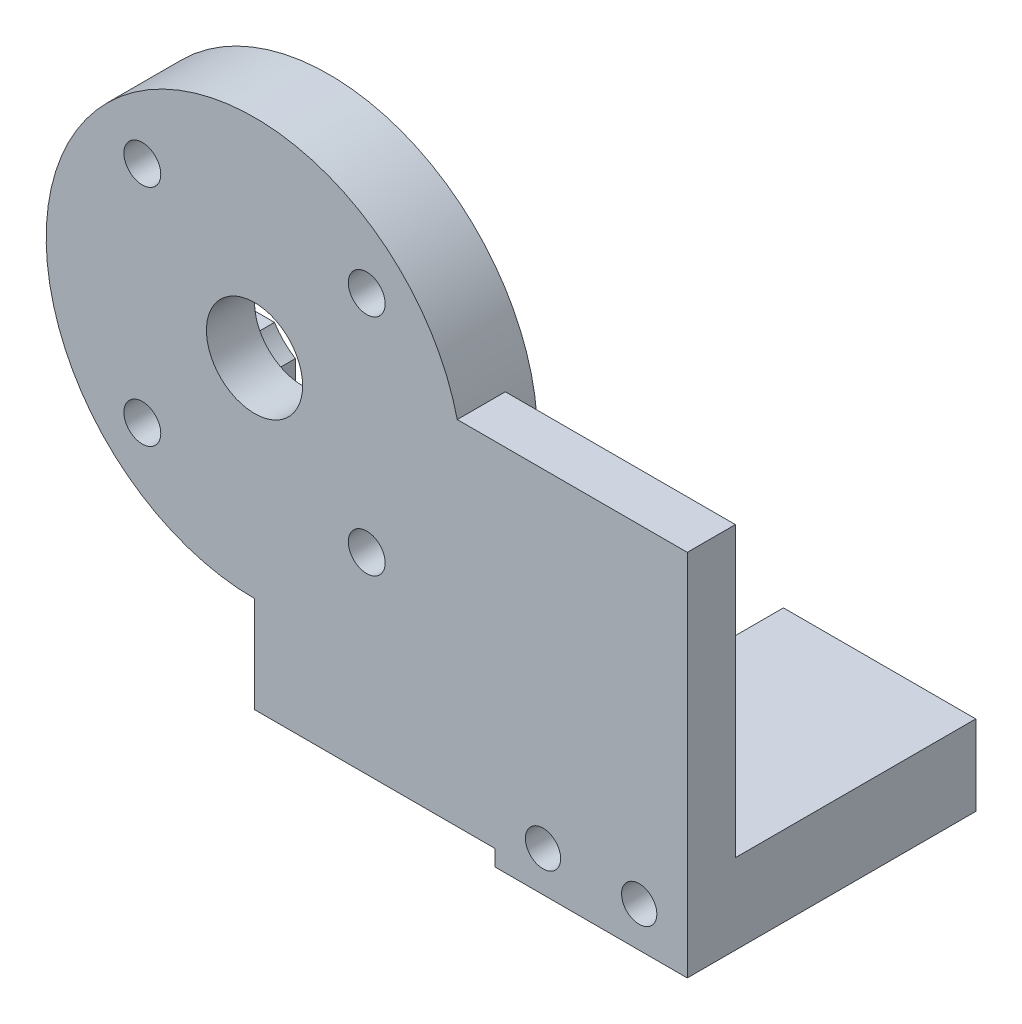
ISO-10303-21;
HEADER;
FILE_DESCRIPTION(('STEP AP214'),'2;1');
FILE_NAME('part.step','',(''),(''),'','','');
FILE_SCHEMA(('AUTOMOTIVE_DESIGN { 1 0 10303 214 1 1 1 1 }'));
ENDSEC;
DATA;
#1=APPLICATION_CONTEXT('core data for automotive mechanical design processes');
#2=APPLICATION_PROTOCOL_DEFINITION('international standard','automotive_design',2000,#1);
#3=PRODUCT_CONTEXT('',#1,'mechanical');
#4=PRODUCT('Part','Part','',(#3));
#5=PRODUCT_RELATED_PRODUCT_CATEGORY('part','',(#4));
#6=PRODUCT_DEFINITION_FORMATION('','',#4);
#7=PRODUCT_DEFINITION_CONTEXT('part definition',#1,'design');
#8=PRODUCT_DEFINITION('design','',#6,#7);
#9=PRODUCT_DEFINITION_SHAPE('','',#8);
#10=(LENGTH_UNIT() NAMED_UNIT(*) SI_UNIT(.MILLI.,.METRE.));
#11=(NAMED_UNIT(*) PLANE_ANGLE_UNIT() SI_UNIT($,.RADIAN.));
#12=(NAMED_UNIT(*) SI_UNIT($,.STERADIAN.) SOLID_ANGLE_UNIT());
#13=UNCERTAINTY_MEASURE_WITH_UNIT(LENGTH_MEASURE(1.E-05),#10,'distance_accuracy_value','');
#14=(GEOMETRIC_REPRESENTATION_CONTEXT(3) GLOBAL_UNCERTAINTY_ASSIGNED_CONTEXT((#13)) GLOBAL_UNIT_ASSIGNED_CONTEXT((#10,
#11,#12)) REPRESENTATION_CONTEXT('',''));
#15=CARTESIAN_POINT('',(0.,0.,0.));
#16=DIRECTION('',(0.,0.,1.));
#17=DIRECTION('',(1.,0.,0.));
#18=AXIS2_PLACEMENT_3D('',#15,#16,#17);
#19=CARTESIAN_POINT('',(0.,0.,13.35));
#20=DIRECTION('',(0.,0.,1.));
#21=DIRECTION('',(1.,0.,0.));
#22=AXIS2_PLACEMENT_3D('',#19,#20,#21);
#23=PLANE('',#22);
#24=CARTESIAN_POINT('',(7.,-7.,13.35));
#25=DIRECTION('',(0.,0.,1.));
#26=DIRECTION('',(1.,0.,0.));
#27=AXIS2_PLACEMENT_3D('',#24,#25,#26);
#28=CIRCLE('',#27,1.15);
#29=CARTESIAN_POINT('',(8.15,-7.,13.35));
#30=VERTEX_POINT('',#29);
#31=EDGE_CURVE('E445',#30,#30,#28,.F.);
#32=ORIENTED_EDGE('',*,*,#31,.F.);
#33=EDGE_LOOP('',(#32));
#34=FACE_BOUND('',#33,.T.);
#35=CARTESIAN_POINT('',(-7.,-7.,13.35));
#36=DIRECTION('',(0.,0.,1.));
#37=DIRECTION('',(1.,0.,0.));
#38=AXIS2_PLACEMENT_3D('',#35,#36,#37);
#39=CIRCLE('',#38,1.15);
#40=CARTESIAN_POINT('',(-5.85,-7.,13.35));
#41=VERTEX_POINT('',#40);
#42=EDGE_CURVE('E437',#41,#41,#39,.F.);
#43=ORIENTED_EDGE('',*,*,#42,.F.);
#44=EDGE_LOOP('',(#43));
#45=FACE_BOUND('',#44,.T.);
#46=CARTESIAN_POINT('',(-7.,7.,13.35));
#47=DIRECTION('',(0.,0.,1.));
#48=DIRECTION('',(1.,0.,0.));
#49=AXIS2_PLACEMENT_3D('',#46,#47,#48);
#50=CIRCLE('',#49,1.15);
#51=CARTESIAN_POINT('',(-5.85,7.,13.35));
#52=VERTEX_POINT('',#51);
#53=EDGE_CURVE('E432',#52,#52,#50,.F.);
#54=ORIENTED_EDGE('',*,*,#53,.F.);
#55=EDGE_LOOP('',(#54));
#56=FACE_BOUND('',#55,.T.);
#57=CARTESIAN_POINT('',(7.,7.,13.35));
#58=DIRECTION('',(0.,0.,1.));
#59=DIRECTION('',(1.,0.,0.));
#60=AXIS2_PLACEMENT_3D('',#57,#58,#59);
#61=CIRCLE('',#60,1.15);
#62=CARTESIAN_POINT('',(8.15,7.,13.35));
#63=VERTEX_POINT('',#62);
#64=EDGE_CURVE('E429',#63,#63,#61,.F.);
#65=ORIENTED_EDGE('',*,*,#64,.F.);
#66=EDGE_LOOP('',(#65));
#67=FACE_BOUND('',#66,.T.);
#68=CARTESIAN_POINT('',(0.,0.,13.35));
#69=DIRECTION('',(0.,0.,1.));
#70=DIRECTION('',(1.,0.,0.));
#71=AXIS2_PLACEMENT_3D('',#68,#69,#70);
#72=CIRCLE('',#71,13.);
#73=CARTESIAN_POINT('',(13.,0.,13.35));
#74=VERTEX_POINT('',#73);
#75=EDGE_CURVE('E271',#74,#74,#72,.T.);
#76=ORIENTED_EDGE('',*,*,#75,.F.);
#77=EDGE_LOOP('',(#76));
#78=FACE_BOUND('',#77,.T.);
#79=DIRECTION('',(-1.,0.,0.));
#80=VECTOR('',#79,1.);
#81=CARTESIAN_POINT('',(-8.15,2.1,13.35));
#82=LINE('',#81,#80);
#83=CARTESIAN_POINT('',(8.15,2.1,13.35));
#84=VERTEX_POINT('',#83);
#85=CARTESIAN_POINT('',(3.40440890610984,2.1,13.35));
#86=VERTEX_POINT('',#85);
#87=EDGE_CURVE('E226',#84,#86,#82,.T.);
#88=ORIENTED_EDGE('',*,*,#87,.T.);
#89=CARTESIAN_POINT('',(0.,0.,13.35));
#90=DIRECTION('',(0.,0.,1.));
#91=DIRECTION('',(1.,0.,0.));
#92=AXIS2_PLACEMENT_3D('',#89,#90,#91);
#93=CIRCLE('',#92,4.);
#94=CARTESIAN_POINT('',(2.1,3.40440890610984,13.35));
#95=VERTEX_POINT('',#94);
#96=EDGE_CURVE('E213',#86,#95,#93,.T.);
#97=ORIENTED_EDGE('',*,*,#96,.T.);
#98=DIRECTION('',(0.,1.,0.));
#99=VECTOR('',#98,1.);
#100=CARTESIAN_POINT('',(2.1,-8.15,13.35));
#101=LINE('',#100,#99);
#102=CARTESIAN_POINT('',(2.1,8.15,13.35));
#103=VERTEX_POINT('',#102);
#104=EDGE_CURVE('E488',#95,#103,#101,.T.);
#105=ORIENTED_EDGE('',*,*,#104,.T.);
#106=CARTESIAN_POINT('',(0.,8.15,13.35));
#107=DIRECTION('',(0.,0.,1.));
#108=DIRECTION('',(1.,0.,0.));
#109=AXIS2_PLACEMENT_3D('',#106,#107,#108);
#110=CIRCLE('',#109,2.1);
#111=CARTESIAN_POINT('',(-2.1,8.15,13.35));
#112=VERTEX_POINT('',#111);
#113=EDGE_CURVE('E458',#103,#112,#110,.T.);
#114=ORIENTED_EDGE('',*,*,#113,.T.);
#115=DIRECTION('',(0.,-1.,0.));
#116=VECTOR('',#115,1.);
#117=CARTESIAN_POINT('',(-2.1,-8.15,13.35));
#118=LINE('',#117,#116);
#119=CARTESIAN_POINT('',(-2.1,3.40440890610984,13.35));
#120=VERTEX_POINT('',#119);
#121=EDGE_CURVE('E482',#112,#120,#118,.T.);
#122=ORIENTED_EDGE('',*,*,#121,.T.);
#123=CARTESIAN_POINT('',(-3.40440890610984,2.1,13.35));
#124=VERTEX_POINT('',#123);
#125=EDGE_CURVE('E72',#120,#124,#93,.T.);
#126=ORIENTED_EDGE('',*,*,#125,.T.);
#127=CARTESIAN_POINT('',(-8.15,2.1,13.35));
#128=VERTEX_POINT('',#127);
#129=EDGE_CURVE('E244',#124,#128,#82,.T.);
#130=ORIENTED_EDGE('',*,*,#129,.T.);
#131=CARTESIAN_POINT('',(-8.15,0.,13.35));
#132=DIRECTION('',(0.,0.,1.));
#133=DIRECTION('',(1.,0.,0.));
#134=AXIS2_PLACEMENT_3D('',#131,#132,#133);
#135=CIRCLE('',#134,2.1);
#136=CARTESIAN_POINT('',(-8.15,-2.1,13.35));
#137=VERTEX_POINT('',#136);
#138=EDGE_CURVE('E454',#128,#137,#135,.T.);
#139=ORIENTED_EDGE('',*,*,#138,.T.);
#140=DIRECTION('',(1.,0.,0.));
#141=VECTOR('',#140,1.);
#142=CARTESIAN_POINT('',(-8.15,-2.1,13.35));
#143=LINE('',#142,#141);
#144=CARTESIAN_POINT('',(-3.40440890610984,-2.1,13.35));
#145=VERTEX_POINT('',#144);
#146=EDGE_CURVE('E249',#137,#145,#143,.T.);
#147=ORIENTED_EDGE('',*,*,#146,.T.);
#148=CARTESIAN_POINT('',(-2.1,-3.40440890610984,13.35));
#149=VERTEX_POINT('',#148);
#150=EDGE_CURVE('E536',#145,#149,#93,.T.);
#151=ORIENTED_EDGE('',*,*,#150,.T.);
#152=CARTESIAN_POINT('',(-2.1,-8.15,13.35));
#153=VERTEX_POINT('',#152);
#154=EDGE_CURVE('E446',#149,#153,#118,.T.);
#155=ORIENTED_EDGE('',*,*,#154,.T.);
#156=CARTESIAN_POINT('',(0.,-8.15,13.35));
#157=DIRECTION('',(0.,0.,1.));
#158=DIRECTION('',(1.,0.,0.));
#159=AXIS2_PLACEMENT_3D('',#156,#157,#158);
#160=CIRCLE('',#159,2.1);
#161=CARTESIAN_POINT('',(2.1,-8.15,13.35));
#162=VERTEX_POINT('',#161);
#163=EDGE_CURVE('E470',#153,#162,#160,.T.);
#164=ORIENTED_EDGE('',*,*,#163,.T.);
#165=CARTESIAN_POINT('',(2.1,-3.40440890610984,13.35));
#166=VERTEX_POINT('',#165);
#167=EDGE_CURVE('E487',#162,#166,#101,.T.);
#168=ORIENTED_EDGE('',*,*,#167,.T.);
#169=CARTESIAN_POINT('',(3.40440890610984,-2.1,13.35));
#170=VERTEX_POINT('',#169);
#171=EDGE_CURVE('E221',#166,#170,#93,.T.);
#172=ORIENTED_EDGE('',*,*,#171,.T.);
#173=CARTESIAN_POINT('',(8.15,-2.1,13.35));
#174=VERTEX_POINT('',#173);
#175=EDGE_CURVE('E501',#170,#174,#143,.T.);
#176=ORIENTED_EDGE('',*,*,#175,.T.);
#177=CARTESIAN_POINT('',(8.15,0.,13.35));
#178=DIRECTION('',(0.,0.,1.));
#179=DIRECTION('',(1.,0.,0.));
#180=AXIS2_PLACEMENT_3D('',#177,#178,#179);
#181=CIRCLE('',#180,2.1);
#182=EDGE_CURVE('E239',#174,#84,#181,.T.);
#183=ORIENTED_EDGE('',*,*,#182,.T.);
#184=EDGE_LOOP('',(#88,#97,#105,#114,#122,#126,#130,#139,#147,#151,#155,#164,#168,#172,#176,#183));
#185=FACE_BOUND('',#184,.T.);
#186=ADVANCED_FACE('F44',(#34,#45,#56,#67,#78,#185),#23,.F.);
#187=CARTESIAN_POINT('',(-8.15,-2.1,15.));
#188=DIRECTION('',(0.,1.,0.));
#189=DIRECTION('',(0.,0.,1.));
#190=AXIS2_PLACEMENT_3D('',#187,#188,#189);
#191=PLANE('',#190);
#192=ORIENTED_EDGE('',*,*,#175,.F.);
#193=DIRECTION('',(0.,0.,-1.));
#194=VECTOR('',#193,1.);
#195=CARTESIAN_POINT('',(3.40440890610984,-2.1,15.));
#196=LINE('',#195,#194);
#197=CARTESIAN_POINT('',(3.40440890610984,-2.1,15.));
#198=VERTEX_POINT('',#197);
#199=EDGE_CURVE('E231',#170,#198,#196,.F.);
#200=ORIENTED_EDGE('',*,*,#199,.T.);
#201=DIRECTION('',(1.,0.,0.));
#202=VECTOR('',#201,1.);
#203=CARTESIAN_POINT('',(-8.15,-2.1,15.));
#204=LINE('',#203,#202);
#205=CARTESIAN_POINT('',(8.15,-2.1,15.));
#206=VERTEX_POINT('',#205);
#207=EDGE_CURVE('E243',#198,#206,#204,.T.);
#208=ORIENTED_EDGE('',*,*,#207,.T.);
#209=DIRECTION('',(0.,0.,-1.));
#210=VECTOR('',#209,1.);
#211=CARTESIAN_POINT('',(8.15,-2.1,15.));
#212=LINE('',#211,#210);
#213=EDGE_CURVE('E259',#206,#174,#212,.T.);
#214=ORIENTED_EDGE('',*,*,#213,.T.);
#215=EDGE_LOOP('',(#192,#200,#208,#214));
#216=FACE_BOUND('',#215,.T.);
#217=ADVANCED_FACE('F544',(#216),#191,.T.);
#218=CARTESIAN_POINT('',(-8.15,2.1,15.));
#219=DIRECTION('',(0.,-1.,0.));
#220=DIRECTION('',(0.,0.,-1.));
#221=AXIS2_PLACEMENT_3D('',#218,#219,#220);
#222=PLANE('',#221);
#223=DIRECTION('',(-1.,0.,0.));
#224=VECTOR('',#223,1.);
#225=CARTESIAN_POINT('',(-8.15,2.1,15.));
#226=LINE('',#225,#224);
#227=CARTESIAN_POINT('',(8.15,2.1,15.));
#228=VERTEX_POINT('',#227);
#229=CARTESIAN_POINT('',(3.40440890610984,2.1,15.));
#230=VERTEX_POINT('',#229);
#231=EDGE_CURVE('E235',#228,#230,#226,.T.);
#232=ORIENTED_EDGE('',*,*,#231,.T.);
#233=DIRECTION('',(0.,0.,-1.));
#234=VECTOR('',#233,1.);
#235=CARTESIAN_POINT('',(3.40440890610984,2.1,15.));
#236=LINE('',#235,#234);
#237=EDGE_CURVE('E216',#230,#86,#236,.T.);
#238=ORIENTED_EDGE('',*,*,#237,.T.);
#239=ORIENTED_EDGE('',*,*,#87,.F.);
#240=DIRECTION('',(0.,0.,-1.));
#241=VECTOR('',#240,1.);
#242=CARTESIAN_POINT('',(8.15,2.1,15.));
#243=LINE('',#242,#241);
#244=EDGE_CURVE('E258',#228,#84,#243,.T.);
#245=ORIENTED_EDGE('',*,*,#244,.F.);
#246=EDGE_LOOP('',(#232,#238,#239,#245));
#247=FACE_BOUND('',#246,.T.);
#248=ADVANCED_FACE('F227',(#247),#222,.T.);
#249=ORIENTED_EDGE('',*,*,#129,.F.);
#250=DIRECTION('',(0.,0.,-1.));
#251=VECTOR('',#250,1.);
#252=CARTESIAN_POINT('',(-3.40440890610984,2.1,15.));
#253=LINE('',#252,#251);
#254=CARTESIAN_POINT('',(-3.40440890610984,2.1,15.));
#255=VERTEX_POINT('',#254);
#256=EDGE_CURVE('E233',#124,#255,#253,.F.);
#257=ORIENTED_EDGE('',*,*,#256,.T.);
#258=CARTESIAN_POINT('',(-8.15,2.1,15.));
#259=VERTEX_POINT('',#258);
#260=EDGE_CURVE('E509',#255,#259,#226,.T.);
#261=ORIENTED_EDGE('',*,*,#260,.T.);
#262=DIRECTION('',(0.,0.,-1.));
#263=VECTOR('',#262,1.);
#264=CARTESIAN_POINT('',(-8.15,2.1,15.));
#265=LINE('',#264,#263);
#266=EDGE_CURVE('E252',#259,#128,#265,.T.);
#267=ORIENTED_EDGE('',*,*,#266,.T.);
#268=EDGE_LOOP('',(#249,#257,#261,#267));
#269=FACE_BOUND('',#268,.T.);
#270=ADVANCED_FACE('F513',(#269),#222,.T.);
#271=CARTESIAN_POINT('',(-8.15,-2.1,15.));
#272=VERTEX_POINT('',#271);
#273=CARTESIAN_POINT('',(-3.40440890610984,-2.1,15.));
#274=VERTEX_POINT('',#273);
#275=EDGE_CURVE('E247',#272,#274,#204,.T.);
#276=ORIENTED_EDGE('',*,*,#275,.T.);
#277=DIRECTION('',(0.,0.,-1.));
#278=VECTOR('',#277,1.);
#279=CARTESIAN_POINT('',(-3.40440890610984,-2.1,15.));
#280=LINE('',#279,#278);
#281=EDGE_CURVE('E404',#274,#145,#280,.T.);
#282=ORIENTED_EDGE('',*,*,#281,.T.);
#283=ORIENTED_EDGE('',*,*,#146,.F.);
#284=DIRECTION('',(0.,0.,-1.));
#285=VECTOR('',#284,1.);
#286=CARTESIAN_POINT('',(-8.15,-2.1,15.));
#287=LINE('',#286,#285);
#288=EDGE_CURVE('E263',#272,#137,#287,.T.);
#289=ORIENTED_EDGE('',*,*,#288,.F.);
#290=EDGE_LOOP('',(#276,#282,#283,#289));
#291=FACE_BOUND('',#290,.T.);
#292=ADVANCED_FACE('F533',(#291),#191,.T.);
#293=CARTESIAN_POINT('',(2.1,-8.15,15.));
#294=DIRECTION('',(-1.,0.,0.));
#295=DIRECTION('',(0.,0.,1.));
#296=AXIS2_PLACEMENT_3D('',#293,#294,#295);
#297=PLANE('',#296);
#298=ORIENTED_EDGE('',*,*,#104,.F.);
#299=DIRECTION('',(0.,0.,-1.));
#300=VECTOR('',#299,1.);
#301=CARTESIAN_POINT('',(2.1,3.40440890610984,15.));
#302=LINE('',#301,#300);
#303=CARTESIAN_POINT('',(2.1,3.40440890610984,15.));
#304=VERTEX_POINT('',#303);
#305=EDGE_CURVE('E220',#95,#304,#302,.F.);
#306=ORIENTED_EDGE('',*,*,#305,.T.);
#307=DIRECTION('',(0.,1.,0.));
#308=VECTOR('',#307,1.);
#309=CARTESIAN_POINT('',(2.1,-8.15,15.));
#310=LINE('',#309,#308);
#311=CARTESIAN_POINT('',(2.1,8.15,15.));
#312=VERTEX_POINT('',#311);
#313=EDGE_CURVE('E480',#304,#312,#310,.T.);
#314=ORIENTED_EDGE('',*,*,#313,.T.);
#315=DIRECTION('',(0.,0.,-1.));
#316=VECTOR('',#315,1.);
#317=CARTESIAN_POINT('',(2.1,8.15,15.));
#318=LINE('',#317,#316);
#319=EDGE_CURVE('E494',#312,#103,#318,.T.);
#320=ORIENTED_EDGE('',*,*,#319,.T.);
#321=EDGE_LOOP('',(#298,#306,#314,#320));
#322=FACE_BOUND('',#321,.T.);
#323=ADVANCED_FACE('F644',(#322),#297,.T.);
#324=CARTESIAN_POINT('',(-2.1,-8.15,15.));
#325=DIRECTION('',(1.,0.,0.));
#326=DIRECTION('',(0.,0.,-1.));
#327=AXIS2_PLACEMENT_3D('',#324,#325,#326);
#328=PLANE('',#327);
#329=DIRECTION('',(0.,-1.,0.));
#330=VECTOR('',#329,1.);
#331=CARTESIAN_POINT('',(-2.1,-8.15,15.));
#332=LINE('',#331,#330);
#333=CARTESIAN_POINT('',(-2.1,8.15,15.));
#334=VERTEX_POINT('',#333);
#335=CARTESIAN_POINT('',(-2.1,3.40440890610984,15.));
#336=VERTEX_POINT('',#335);
#337=EDGE_CURVE('E471',#334,#336,#332,.T.);
#338=ORIENTED_EDGE('',*,*,#337,.T.);
#339=DIRECTION('',(0.,0.,-1.));
#340=VECTOR('',#339,1.);
#341=CARTESIAN_POINT('',(-2.1,3.40440890610984,15.));
#342=LINE('',#341,#340);
#343=EDGE_CURVE('E396',#336,#120,#342,.T.);
#344=ORIENTED_EDGE('',*,*,#343,.T.);
#345=ORIENTED_EDGE('',*,*,#121,.F.);
#346=DIRECTION('',(0.,0.,-1.));
#347=VECTOR('',#346,1.);
#348=CARTESIAN_POINT('',(-2.1,8.15,15.));
#349=LINE('',#348,#347);
#350=EDGE_CURVE('E483',#334,#112,#349,.T.);
#351=ORIENTED_EDGE('',*,*,#350,.F.);
#352=EDGE_LOOP('',(#338,#344,#345,#351));
#353=FACE_BOUND('',#352,.T.);
#354=ADVANCED_FACE('F775',(#353),#328,.T.);
#355=ORIENTED_EDGE('',*,*,#154,.F.);
#356=DIRECTION('',(0.,0.,-1.));
#357=VECTOR('',#356,1.);
#358=CARTESIAN_POINT('',(-2.1,-3.40440890610984,15.));
#359=LINE('',#358,#357);
#360=CARTESIAN_POINT('',(-2.1,-3.40440890610984,15.));
#361=VERTEX_POINT('',#360);
#362=EDGE_CURVE('E392',#149,#361,#359,.F.);
#363=ORIENTED_EDGE('',*,*,#362,.T.);
#364=CARTESIAN_POINT('',(-2.1,-8.15,15.));
#365=VERTEX_POINT('',#364);
#366=EDGE_CURVE('E476',#361,#365,#332,.T.);
#367=ORIENTED_EDGE('',*,*,#366,.T.);
#368=DIRECTION('',(0.,0.,-1.));
#369=VECTOR('',#368,1.);
#370=CARTESIAN_POINT('',(-2.1,-8.15,15.));
#371=LINE('',#370,#369);
#372=EDGE_CURVE('E504',#365,#153,#371,.T.);
#373=ORIENTED_EDGE('',*,*,#372,.T.);
#374=EDGE_LOOP('',(#355,#363,#367,#373));
#375=FACE_BOUND('',#374,.T.);
#376=ADVANCED_FACE('F568',(#375),#328,.T.);
#377=CARTESIAN_POINT('',(2.1,-8.15,15.));
#378=VERTEX_POINT('',#377);
#379=CARTESIAN_POINT('',(2.1,-3.40440890610984,15.));
#380=VERTEX_POINT('',#379);
#381=EDGE_CURVE('E479',#378,#380,#310,.T.);
#382=ORIENTED_EDGE('',*,*,#381,.T.);
#383=DIRECTION('',(0.,0.,-1.));
#384=VECTOR('',#383,1.);
#385=CARTESIAN_POINT('',(2.1,-3.40440890610984,15.));
#386=LINE('',#385,#384);
#387=EDGE_CURVE('E11',#380,#166,#386,.T.);
#388=ORIENTED_EDGE('',*,*,#387,.T.);
#389=ORIENTED_EDGE('',*,*,#167,.F.);
#390=DIRECTION('',(0.,0.,-1.));
#391=VECTOR('',#390,1.);
#392=CARTESIAN_POINT('',(2.1,-8.15,15.));
#393=LINE('',#392,#391);
#394=EDGE_CURVE('E496',#378,#162,#393,.T.);
#395=ORIENTED_EDGE('',*,*,#394,.F.);
#396=EDGE_LOOP('',(#382,#388,#389,#395));
#397=FACE_BOUND('',#396,.T.);
#398=ADVANCED_FACE('F561',(#397),#297,.T.);
#399=CARTESIAN_POINT('',(0.,0.,15.));
#400=DIRECTION('',(0.,0.,1.));
#401=DIRECTION('',(1.,0.,0.));
#402=AXIS2_PLACEMENT_3D('',#399,#400,#401);
#403=PLANE('',#402);
#404=DIRECTION('',(0.,-1.,0.));
#405=VECTOR('',#404,1.);
#406=CARTESIAN_POINT('',(0.,-19.,15.));
#407=LINE('',#406,#405);
#408=CARTESIAN_POINT('',(0.,-13.,15.));
#409=VERTEX_POINT('',#408);
#410=CARTESIAN_POINT('',(0.,-19.,15.));
#411=VERTEX_POINT('',#410);
#412=EDGE_CURVE('E321',#409,#411,#407,.T.);
#413=ORIENTED_EDGE('',*,*,#412,.F.);
#414=CARTESIAN_POINT('',(0.,0.,15.));
#415=DIRECTION('',(0.,0.,1.));
#416=DIRECTION('',(1.,0.,0.));
#417=AXIS2_PLACEMENT_3D('',#414,#415,#416);
#418=CIRCLE('',#417,13.);
#419=CARTESIAN_POINT('',(12.6491106406735,3.,15.));
#420=VERTEX_POINT('',#419);
#421=EDGE_CURVE('E270',#409,#420,#418,.T.);
#422=ORIENTED_EDGE('',*,*,#421,.T.);
#423=DIRECTION('',(-1.,0.,0.));
#424=VECTOR('',#423,1.);
#425=CARTESIAN_POINT('',(0.,3.,15.));
#426=LINE('',#425,#424);
#427=CARTESIAN_POINT('',(27.,3.,15.));
#428=VERTEX_POINT('',#427);
#429=EDGE_CURVE('E326',#428,#420,#426,.T.);
#430=ORIENTED_EDGE('',*,*,#429,.F.);
#431=DIRECTION('',(0.,1.,0.));
#432=VECTOR('',#431,1.);
#433=CARTESIAN_POINT('',(27.,-19.,15.));
#434=LINE('',#433,#432);
#435=CARTESIAN_POINT('',(27.,-15.,15.));
#436=VERTEX_POINT('',#435);
#437=EDGE_CURVE('E344',#436,#428,#434,.T.);
#438=ORIENTED_EDGE('',*,*,#437,.F.);
#439=DIRECTION('',(1.,0.,0.));
#440=VECTOR('',#439,1.);
#441=CARTESIAN_POINT('',(0.,-15.,15.));
#442=LINE('',#441,#440);
#443=CARTESIAN_POINT('',(15.,-15.,15.));
#444=VERTEX_POINT('',#443);
#445=EDGE_CURVE('E54',#444,#436,#442,.T.);
#446=ORIENTED_EDGE('',*,*,#445,.F.);
#447=DIRECTION('',(0.,1.,0.));
#448=VECTOR('',#447,1.);
#449=CARTESIAN_POINT('',(15.,0.,15.));
#450=LINE('',#449,#448);
#451=CARTESIAN_POINT('',(15.,-19.,15.));
#452=VERTEX_POINT('',#451);
#453=EDGE_CURVE('E320',#452,#444,#450,.T.);
#454=ORIENTED_EDGE('',*,*,#453,.F.);
#455=DIRECTION('',(1.,0.,0.));
#456=VECTOR('',#455,1.);
#457=CARTESIAN_POINT('',(0.,-19.,15.));
#458=LINE('',#457,#456);
#459=EDGE_CURVE('E336',#411,#452,#458,.T.);
#460=ORIENTED_EDGE('',*,*,#459,.F.);
#461=EDGE_LOOP('',(#413,#422,#430,#438,#446,#454,#460));
#462=FACE_BOUND('',#461,.T.);
#463=ADVANCED_FACE('F630',(#462),#403,.F.);
#464=CARTESIAN_POINT('',(0.,-19.,18.));
#465=DIRECTION('',(0.,1.,0.));
#466=DIRECTION('',(0.,0.,1.));
#467=AXIS2_PLACEMENT_3D('',#464,#465,#466);
#468=PLANE('',#467);
#469=DIRECTION('',(0.,0.,-1.));
#470=VECTOR('',#469,1.);
#471=CARTESIAN_POINT('',(15.,-19.,18.));
#472=LINE('',#471,#470);
#473=CARTESIAN_POINT('',(15.,-19.,18.));
#474=VERTEX_POINT('',#473);
#475=EDGE_CURVE('E366',#474,#452,#472,.T.);
#476=ORIENTED_EDGE('',*,*,#475,.F.);
#477=DIRECTION('',(1.,0.,0.));
#478=VECTOR('',#477,1.);
#479=CARTESIAN_POINT('',(0.,-19.,18.));
#480=LINE('',#479,#478);
#481=CARTESIAN_POINT('',(0.,-19.,18.));
#482=VERTEX_POINT('',#481);
#483=EDGE_CURVE('E324',#482,#474,#480,.T.);
#484=ORIENTED_EDGE('',*,*,#483,.F.);
#485=DIRECTION('',(0.,0.,-1.));
#486=VECTOR('',#485,1.);
#487=CARTESIAN_POINT('',(0.,-19.,18.));
#488=LINE('',#487,#486);
#489=EDGE_CURVE('E354',#482,#411,#488,.T.);
#490=ORIENTED_EDGE('',*,*,#489,.T.);
#491=ORIENTED_EDGE('',*,*,#459,.T.);
#492=EDGE_LOOP('',(#476,#484,#490,#491));
#493=FACE_BOUND('',#492,.T.);
#494=ADVANCED_FACE('F628',(#493),#468,.F.);
#495=CARTESIAN_POINT('',(0.,0.,18.));
#496=DIRECTION('',(0.,0.,-1.));
#497=DIRECTION('',(-1.,0.,0.));
#498=AXIS2_PLACEMENT_3D('',#495,#496,#497);
#499=CYLINDRICAL_SURFACE('',#498,13.);
#500=DIRECTION('',(0.,0.,-1.));
#501=VECTOR('',#500,1.);
#502=CARTESIAN_POINT('',(0.,-13.,18.));
#503=LINE('',#502,#501);
#504=CARTESIAN_POINT('',(0.,-13.,18.));
#505=VERTEX_POINT('',#504);
#506=EDGE_CURVE('E365',#505,#409,#503,.T.);
#507=ORIENTED_EDGE('',*,*,#506,.F.);
#508=CARTESIAN_POINT('',(0.,0.,18.));
#509=DIRECTION('',(0.,0.,1.));
#510=DIRECTION('',(1.,0.,0.));
#511=AXIS2_PLACEMENT_3D('',#508,#509,#510);
#512=CIRCLE('',#511,13.);
#513=CARTESIAN_POINT('',(12.6491106406735,3.,18.));
#514=VERTEX_POINT('',#513);
#515=EDGE_CURVE('E358',#514,#505,#512,.T.);
#516=ORIENTED_EDGE('',*,*,#515,.F.);
#517=DIRECTION('',(0.,0.,-1.));
#518=VECTOR('',#517,1.);
#519=CARTESIAN_POINT('',(12.6491106406735,3.,18.));
#520=LINE('',#519,#518);
#521=EDGE_CURVE('E357',#420,#514,#520,.F.);
#522=ORIENTED_EDGE('',*,*,#521,.F.);
#523=ORIENTED_EDGE('',*,*,#421,.F.);
#524=EDGE_LOOP('',(#507,#516,#522,#523));
#525=FACE_BOUND('',#524,.T.);
#526=ORIENTED_EDGE('',*,*,#75,.T.);
#527=EDGE_LOOP('',(#526));
#528=FACE_BOUND('',#527,.T.);
#529=ADVANCED_FACE('F50',(#525,#528),#499,.T.);
#530=CARTESIAN_POINT('',(0.,0.,18.));
#531=DIRECTION('',(0.,0.,1.));
#532=DIRECTION('',(1.,0.,0.));
#533=AXIS2_PLACEMENT_3D('',#530,#531,#532);
#534=PLANE('',#533);
#535=CARTESIAN_POINT('',(18.,-17.5,18.));
#536=DIRECTION('',(0.,0.,1.));
#537=DIRECTION('',(1.,0.,0.));
#538=AXIS2_PLACEMENT_3D('',#535,#536,#537);
#539=CIRCLE('',#538,1.1);
#540=CARTESIAN_POINT('',(19.1,-17.5,18.));
#541=VERTEX_POINT('',#540);
#542=EDGE_CURVE('E380',#541,#541,#539,.T.);
#543=ORIENTED_EDGE('',*,*,#542,.F.);
#544=EDGE_LOOP('',(#543));
#545=FACE_BOUND('',#544,.T.);
#546=CARTESIAN_POINT('',(24.,-17.5,18.));
#547=DIRECTION('',(0.,0.,1.));
#548=DIRECTION('',(1.,0.,0.));
#549=AXIS2_PLACEMENT_3D('',#546,#547,#548);
#550=CIRCLE('',#549,1.1);
#551=CARTESIAN_POINT('',(25.1,-17.5,18.));
#552=VERTEX_POINT('',#551);
#553=EDGE_CURVE('E383',#552,#552,#550,.T.);
#554=ORIENTED_EDGE('',*,*,#553,.F.);
#555=EDGE_LOOP('',(#554));
#556=FACE_BOUND('',#555,.T.);
#557=CARTESIAN_POINT('',(7.,-7.,18.));
#558=DIRECTION('',(0.,0.,1.));
#559=DIRECTION('',(1.,0.,0.));
#560=AXIS2_PLACEMENT_3D('',#557,#558,#559);
#561=CIRCLE('',#560,1.15);
#562=CARTESIAN_POINT('',(8.15,-7.,18.));
#563=VERTEX_POINT('',#562);
#564=EDGE_CURVE('E411',#563,#563,#561,.T.);
#565=ORIENTED_EDGE('',*,*,#564,.F.);
#566=EDGE_LOOP('',(#565));
#567=FACE_BOUND('',#566,.T.);
#568=CARTESIAN_POINT('',(-7.,-7.,18.));
#569=DIRECTION('',(0.,0.,1.));
#570=DIRECTION('',(1.,0.,0.));
#571=AXIS2_PLACEMENT_3D('',#568,#569,#570);
#572=CIRCLE('',#571,1.15);
#573=CARTESIAN_POINT('',(-5.85,-7.,18.));
#574=VERTEX_POINT('',#573);
#575=EDGE_CURVE('E419',#574,#574,#572,.T.);
#576=ORIENTED_EDGE('',*,*,#575,.F.);
#577=EDGE_LOOP('',(#576));
#578=FACE_BOUND('',#577,.T.);
#579=CARTESIAN_POINT('',(-7.,7.,18.));
#580=DIRECTION('',(0.,0.,1.));
#581=DIRECTION('',(1.,0.,0.));
#582=AXIS2_PLACEMENT_3D('',#579,#580,#581);
#583=CIRCLE('',#582,1.15);
#584=CARTESIAN_POINT('',(-5.85,7.,18.));
#585=VERTEX_POINT('',#584);
#586=EDGE_CURVE('E413',#585,#585,#583,.T.);
#587=ORIENTED_EDGE('',*,*,#586,.F.);
#588=EDGE_LOOP('',(#587));
#589=FACE_BOUND('',#588,.T.);
#590=CARTESIAN_POINT('',(7.,7.,18.));
#591=DIRECTION('',(0.,0.,1.));
#592=DIRECTION('',(1.,0.,0.));
#593=AXIS2_PLACEMENT_3D('',#590,#591,#592);
#594=CIRCLE('',#593,1.15);
#595=CARTESIAN_POINT('',(8.15,7.,18.));
#596=VERTEX_POINT('',#595);
#597=EDGE_CURVE('E420',#596,#596,#594,.T.);
#598=ORIENTED_EDGE('',*,*,#597,.F.);
#599=EDGE_LOOP('',(#598));
#600=FACE_BOUND('',#599,.T.);
#601=CARTESIAN_POINT('',(0.,0.,18.));
#602=DIRECTION('',(0.,0.,1.));
#603=DIRECTION('',(1.,0.,0.));
#604=AXIS2_PLACEMENT_3D('',#601,#602,#603);
#605=CIRCLE('',#604,3.);
#606=CARTESIAN_POINT('',(3.,0.,18.));
#607=VERTEX_POINT('',#606);
#608=EDGE_CURVE('E269',#607,#607,#605,.T.);
#609=ORIENTED_EDGE('',*,*,#608,.F.);
#610=EDGE_LOOP('',(#609));
#611=FACE_BOUND('',#610,.T.);
#612=ORIENTED_EDGE('',*,*,#483,.T.);
#613=DIRECTION('',(0.,-1.,0.));
#614=VECTOR('',#613,1.);
#615=CARTESIAN_POINT('',(15.,-20.,18.));
#616=LINE('',#615,#614);
#617=CARTESIAN_POINT('',(15.,-20.,18.));
#618=VERTEX_POINT('',#617);
#619=EDGE_CURVE('E284',#474,#618,#616,.T.);
#620=ORIENTED_EDGE('',*,*,#619,.T.);
#621=DIRECTION('',(1.,0.,0.));
#622=VECTOR('',#621,1.);
#623=CARTESIAN_POINT('',(15.,-20.,18.));
#624=LINE('',#623,#622);
#625=CARTESIAN_POINT('',(27.,-20.,18.));
#626=VERTEX_POINT('',#625);
#627=EDGE_CURVE('E281',#618,#626,#624,.T.);
#628=ORIENTED_EDGE('',*,*,#627,.T.);
#629=DIRECTION('',(0.,1.,0.));
#630=VECTOR('',#629,1.);
#631=CARTESIAN_POINT('',(27.,-19.,18.));
#632=LINE('',#631,#630);
#633=CARTESIAN_POINT('',(27.,3.,18.));
#634=VERTEX_POINT('',#633);
#635=EDGE_CURVE('E329',#626,#634,#632,.T.);
#636=ORIENTED_EDGE('',*,*,#635,.T.);
#637=DIRECTION('',(-1.,0.,0.));
#638=VECTOR('',#637,1.);
#639=CARTESIAN_POINT('',(0.,3.,18.));
#640=LINE('',#639,#638);
#641=EDGE_CURVE('E334',#634,#514,#640,.T.);
#642=ORIENTED_EDGE('',*,*,#641,.T.);
#643=ORIENTED_EDGE('',*,*,#515,.T.);
#644=DIRECTION('',(0.,-1.,0.));
#645=VECTOR('',#644,1.);
#646=CARTESIAN_POINT('',(0.,-19.,18.));
#647=LINE('',#646,#645);
#648=EDGE_CURVE('E325',#505,#482,#647,.T.);
#649=ORIENTED_EDGE('',*,*,#648,.T.);
#650=EDGE_LOOP('',(#612,#620,#628,#636,#642,#643,#649));
#651=FACE_BOUND('',#650,.T.);
#652=ADVANCED_FACE('F634',(#545,#556,#567,#578,#589,#600,#611,#651),#534,.T.);
#653=CARTESIAN_POINT('',(0.,-19.,18.));
#654=DIRECTION('',(1.,0.,0.));
#655=DIRECTION('',(0.,0.,-1.));
#656=AXIS2_PLACEMENT_3D('',#653,#654,#655);
#657=PLANE('',#656);
#658=ORIENTED_EDGE('',*,*,#648,.F.);
#659=ORIENTED_EDGE('',*,*,#506,.T.);
#660=ORIENTED_EDGE('',*,*,#412,.T.);
#661=ORIENTED_EDGE('',*,*,#489,.F.);
#662=EDGE_LOOP('',(#658,#659,#660,#661));
#663=FACE_BOUND('',#662,.T.);
#664=ADVANCED_FACE('F622',(#663),#657,.F.);
#665=CARTESIAN_POINT('',(0.,3.,18.));
#666=DIRECTION('',(0.,-1.,0.));
#667=DIRECTION('',(0.,0.,-1.));
#668=AXIS2_PLACEMENT_3D('',#665,#666,#667);
#669=PLANE('',#668);
#670=ORIENTED_EDGE('',*,*,#429,.T.);
#671=ORIENTED_EDGE('',*,*,#521,.T.);
#672=ORIENTED_EDGE('',*,*,#641,.F.);
#673=DIRECTION('',(0.,0.,-1.));
#674=VECTOR('',#673,1.);
#675=CARTESIAN_POINT('',(27.,3.,18.));
#676=LINE('',#675,#674);
#677=EDGE_CURVE('E339',#634,#428,#676,.T.);
#678=ORIENTED_EDGE('',*,*,#677,.T.);
#679=EDGE_LOOP('',(#670,#671,#672,#678));
#680=FACE_BOUND('',#679,.T.);
#681=ADVANCED_FACE('F619',(#680),#669,.F.);
#682=CARTESIAN_POINT('',(27.,-19.,18.));
#683=DIRECTION('',(-1.,0.,0.));
#684=DIRECTION('',(0.,0.,1.));
#685=AXIS2_PLACEMENT_3D('',#682,#683,#684);
#686=PLANE('',#685);
#687=DIRECTION('',(0.,0.,-1.));
#688=VECTOR('',#687,1.);
#689=CARTESIAN_POINT('',(27.,-15.,18.));
#690=LINE('',#689,#688);
#691=CARTESIAN_POINT('',(27.,-15.,0.));
#692=VERTEX_POINT('',#691);
#693=EDGE_CURVE('E308',#436,#692,#690,.T.);
#694=ORIENTED_EDGE('',*,*,#693,.F.);
#695=ORIENTED_EDGE('',*,*,#437,.T.);
#696=ORIENTED_EDGE('',*,*,#677,.F.);
#697=ORIENTED_EDGE('',*,*,#635,.F.);
#698=DIRECTION('',(0.,0.,-1.));
#699=VECTOR('',#698,1.);
#700=CARTESIAN_POINT('',(27.,-20.,18.));
#701=LINE('',#700,#699);
#702=CARTESIAN_POINT('',(27.,-20.,0.));
#703=VERTEX_POINT('',#702);
#704=EDGE_CURVE('E310',#626,#703,#701,.T.);
#705=ORIENTED_EDGE('',*,*,#704,.T.);
#706=DIRECTION('',(0.,1.,0.));
#707=VECTOR('',#706,1.);
#708=CARTESIAN_POINT('',(27.,-20.,0.));
#709=LINE('',#708,#707);
#710=EDGE_CURVE('E299',#703,#692,#709,.T.);
#711=ORIENTED_EDGE('',*,*,#710,.T.);
#712=EDGE_LOOP('',(#694,#695,#696,#697,#705,#711));
#713=FACE_BOUND('',#712,.T.);
#714=ADVANCED_FACE('F608',(#713),#686,.F.);
#715=CARTESIAN_POINT('',(15.,-15.,18.));
#716=DIRECTION('',(0.,-1.,0.));
#717=DIRECTION('',(0.,0.,-1.));
#718=AXIS2_PLACEMENT_3D('',#715,#716,#717);
#719=PLANE('',#718);
#720=DIRECTION('',(0.,0.,-1.));
#721=VECTOR('',#720,1.);
#722=CARTESIAN_POINT('',(15.,-15.,18.));
#723=LINE('',#722,#721);
#724=CARTESIAN_POINT('',(15.,-15.,0.));
#725=VERTEX_POINT('',#724);
#726=EDGE_CURVE('E288',#444,#725,#723,.T.);
#727=ORIENTED_EDGE('',*,*,#726,.F.);
#728=ORIENTED_EDGE('',*,*,#445,.T.);
#729=ORIENTED_EDGE('',*,*,#693,.T.);
#730=DIRECTION('',(-1.,0.,0.));
#731=VECTOR('',#730,1.);
#732=CARTESIAN_POINT('',(15.,-15.,0.));
#733=LINE('',#732,#731);
#734=EDGE_CURVE('E287',#692,#725,#733,.T.);
#735=ORIENTED_EDGE('',*,*,#734,.T.);
#736=EDGE_LOOP('',(#727,#728,#729,#735));
#737=FACE_BOUND('',#736,.T.);
#738=ADVANCED_FACE('F607',(#737),#719,.F.);
#739=CARTESIAN_POINT('',(15.,-20.,18.));
#740=DIRECTION('',(1.,0.,0.));
#741=DIRECTION('',(0.,0.,-1.));
#742=AXIS2_PLACEMENT_3D('',#739,#740,#741);
#743=PLANE('',#742);
#744=ORIENTED_EDGE('',*,*,#475,.T.);
#745=ORIENTED_EDGE('',*,*,#453,.T.);
#746=ORIENTED_EDGE('',*,*,#726,.T.);
#747=DIRECTION('',(0.,-1.,0.));
#748=VECTOR('',#747,1.);
#749=CARTESIAN_POINT('',(15.,-20.,0.));
#750=LINE('',#749,#748);
#751=CARTESIAN_POINT('',(15.,-20.,0.));
#752=VERTEX_POINT('',#751);
#753=EDGE_CURVE('E283',#725,#752,#750,.T.);
#754=ORIENTED_EDGE('',*,*,#753,.T.);
#755=DIRECTION('',(0.,0.,-1.));
#756=VECTOR('',#755,1.);
#757=CARTESIAN_POINT('',(15.,-20.,18.));
#758=LINE('',#757,#756);
#759=EDGE_CURVE('E311',#618,#752,#758,.T.);
#760=ORIENTED_EDGE('',*,*,#759,.F.);
#761=ORIENTED_EDGE('',*,*,#619,.F.);
#762=EDGE_LOOP('',(#744,#745,#746,#754,#760,#761));
#763=FACE_BOUND('',#762,.T.);
#764=ADVANCED_FACE('F606',(#763),#743,.F.);
#765=CARTESIAN_POINT('',(15.,-20.,18.));
#766=DIRECTION('',(0.,1.,0.));
#767=DIRECTION('',(0.,0.,1.));
#768=AXIS2_PLACEMENT_3D('',#765,#766,#767);
#769=PLANE('',#768);
#770=DIRECTION('',(1.,0.,0.));
#771=VECTOR('',#770,1.);
#772=CARTESIAN_POINT('',(15.,-20.,0.));
#773=LINE('',#772,#771);
#774=EDGE_CURVE('E294',#752,#703,#773,.T.);
#775=ORIENTED_EDGE('',*,*,#774,.T.);
#776=ORIENTED_EDGE('',*,*,#704,.F.);
#777=ORIENTED_EDGE('',*,*,#627,.F.);
#778=ORIENTED_EDGE('',*,*,#759,.T.);
#779=EDGE_LOOP('',(#775,#776,#777,#778));
#780=FACE_BOUND('',#779,.T.);
#781=ADVANCED_FACE('F603',(#780),#769,.F.);
#782=CARTESIAN_POINT('',(0.,0.,0.));
#783=DIRECTION('',(0.,0.,-1.));
#784=DIRECTION('',(-1.,0.,0.));
#785=AXIS2_PLACEMENT_3D('',#782,#783,#784);
#786=PLANE('',#785);
#787=CARTESIAN_POINT('',(18.,-17.5,0.));
#788=DIRECTION('',(0.,0.,-1.));
#789=DIRECTION('',(-1.,0.,0.));
#790=AXIS2_PLACEMENT_3D('',#787,#788,#789);
#791=CIRCLE('',#790,1.1);
#792=CARTESIAN_POINT('',(16.9,-17.5,0.));
#793=VERTEX_POINT('',#792);
#794=EDGE_CURVE('E47',#793,#793,#791,.F.);
#795=ORIENTED_EDGE('',*,*,#794,.T.);
#796=EDGE_LOOP('',(#795));
#797=FACE_BOUND('',#796,.T.);
#798=CARTESIAN_POINT('',(24.,-17.5,0.));
#799=DIRECTION('',(0.,0.,-1.));
#800=DIRECTION('',(-1.,0.,0.));
#801=AXIS2_PLACEMENT_3D('',#798,#799,#800);
#802=CIRCLE('',#801,1.1);
#803=CARTESIAN_POINT('',(22.9,-17.5,0.));
#804=VERTEX_POINT('',#803);
#805=EDGE_CURVE('E372',#804,#804,#802,.F.);
#806=ORIENTED_EDGE('',*,*,#805,.T.);
#807=EDGE_LOOP('',(#806));
#808=FACE_BOUND('',#807,.T.);
#809=ORIENTED_EDGE('',*,*,#753,.F.);
#810=ORIENTED_EDGE('',*,*,#734,.F.);
#811=ORIENTED_EDGE('',*,*,#710,.F.);
#812=ORIENTED_EDGE('',*,*,#774,.F.);
#813=EDGE_LOOP('',(#809,#810,#811,#812));
#814=FACE_BOUND('',#813,.T.);
#815=ADVANCED_FACE('F599',(#797,#808,#814),#786,.T.);
#816=CARTESIAN_POINT('',(0.,0.,18.));
#817=DIRECTION('',(0.,0.,-1.));
#818=DIRECTION('',(-1.,0.,0.));
#819=AXIS2_PLACEMENT_3D('',#816,#817,#818);
#820=CYLINDRICAL_SURFACE('',#819,3.);
#821=ORIENTED_EDGE('',*,*,#608,.T.);
#822=EDGE_LOOP('',(#821));
#823=FACE_BOUND('',#822,.T.);
#824=CARTESIAN_POINT('',(0.,0.,15.));
#825=DIRECTION('',(0.,0.,1.));
#826=DIRECTION('',(1.,0.,0.));
#827=AXIS2_PLACEMENT_3D('',#824,#825,#826);
#828=CIRCLE('',#827,3.);
#829=CARTESIAN_POINT('',(3.,0.,15.));
#830=VERTEX_POINT('',#829);
#831=EDGE_CURVE('E266',#830,#830,#828,.T.);
#832=ORIENTED_EDGE('',*,*,#831,.F.);
#833=EDGE_LOOP('',(#832));
#834=FACE_BOUND('',#833,.T.);
#835=ADVANCED_FACE('F600',(#823,#834),#820,.F.);
#836=CARTESIAN_POINT('',(0.,0.,15.));
#837=DIRECTION('',(0.,0.,1.));
#838=DIRECTION('',(1.,0.,0.));
#839=AXIS2_PLACEMENT_3D('',#836,#837,#838);
#840=PLANE('',#839);
#841=ORIENTED_EDGE('',*,*,#366,.F.);
#842=CARTESIAN_POINT('',(0.,0.,15.));
#843=DIRECTION('',(0.,0.,1.));
#844=DIRECTION('',(1.,0.,0.));
#845=AXIS2_PLACEMENT_3D('',#842,#843,#844);
#846=CIRCLE('',#845,4.);
#847=EDGE_CURVE('E526',#274,#361,#846,.T.);
#848=ORIENTED_EDGE('',*,*,#847,.F.);
#849=ORIENTED_EDGE('',*,*,#275,.F.);
#850=CARTESIAN_POINT('',(-8.15,0.,15.));
#851=DIRECTION('',(0.,0.,1.));
#852=DIRECTION('',(1.,0.,0.));
#853=AXIS2_PLACEMENT_3D('',#850,#851,#852);
#854=CIRCLE('',#853,2.1);
#855=EDGE_CURVE('E460',#259,#272,#854,.T.);
#856=ORIENTED_EDGE('',*,*,#855,.F.);
#857=ORIENTED_EDGE('',*,*,#260,.F.);
#858=EDGE_CURVE('E395',#336,#255,#846,.T.);
#859=ORIENTED_EDGE('',*,*,#858,.F.);
#860=ORIENTED_EDGE('',*,*,#337,.F.);
#861=CARTESIAN_POINT('',(0.,8.15,15.));
#862=DIRECTION('',(0.,0.,1.));
#863=DIRECTION('',(1.,0.,0.));
#864=AXIS2_PLACEMENT_3D('',#861,#862,#863);
#865=CIRCLE('',#864,2.1);
#866=EDGE_CURVE('E465',#312,#334,#865,.T.);
#867=ORIENTED_EDGE('',*,*,#866,.F.);
#868=ORIENTED_EDGE('',*,*,#313,.F.);
#869=EDGE_CURVE('E62',#230,#304,#846,.T.);
#870=ORIENTED_EDGE('',*,*,#869,.F.);
#871=ORIENTED_EDGE('',*,*,#231,.F.);
#872=CARTESIAN_POINT('',(8.15,0.,15.));
#873=DIRECTION('',(0.,0.,1.));
#874=DIRECTION('',(1.,0.,0.));
#875=AXIS2_PLACEMENT_3D('',#872,#873,#874);
#876=CIRCLE('',#875,2.1);
#877=EDGE_CURVE('E449',#206,#228,#876,.T.);
#878=ORIENTED_EDGE('',*,*,#877,.F.);
#879=ORIENTED_EDGE('',*,*,#207,.F.);
#880=EDGE_CURVE('E225',#380,#198,#846,.T.);
#881=ORIENTED_EDGE('',*,*,#880,.F.);
#882=ORIENTED_EDGE('',*,*,#381,.F.);
#883=CARTESIAN_POINT('',(0.,-8.15,15.));
#884=DIRECTION('',(0.,0.,1.));
#885=DIRECTION('',(1.,0.,0.));
#886=AXIS2_PLACEMENT_3D('',#883,#884,#885);
#887=CIRCLE('',#886,2.1);
#888=EDGE_CURVE('E448',#365,#378,#887,.T.);
#889=ORIENTED_EDGE('',*,*,#888,.F.);
#890=EDGE_LOOP('',(#841,#848,#849,#856,#857,#859,#860,#867,#868,#870,#871,#878,#879,#881,#882,#889));
#891=FACE_BOUND('',#890,.T.);
#892=ORIENTED_EDGE('',*,*,#831,.T.);
#893=EDGE_LOOP('',(#892));
#894=FACE_BOUND('',#893,.T.);
#895=ADVANCED_FACE('F521',(#891,#894),#840,.F.);
#896=CARTESIAN_POINT('',(0.,-8.15,15.));
#897=DIRECTION('',(0.,0.,-1.));
#898=DIRECTION('',(-1.,0.,0.));
#899=AXIS2_PLACEMENT_3D('',#896,#897,#898);
#900=CYLINDRICAL_SURFACE('',#899,2.1);
#901=ORIENTED_EDGE('',*,*,#163,.F.);
#902=ORIENTED_EDGE('',*,*,#372,.F.);
#903=ORIENTED_EDGE('',*,*,#888,.T.);
#904=ORIENTED_EDGE('',*,*,#394,.T.);
#905=EDGE_LOOP('',(#901,#902,#903,#904));
#906=FACE_BOUND('',#905,.T.);
#907=ADVANCED_FACE('F570',(#906),#900,.F.);
#908=CARTESIAN_POINT('',(0.,8.15,15.));
#909=DIRECTION('',(0.,0.,-1.));
#910=DIRECTION('',(-1.,0.,0.));
#911=AXIS2_PLACEMENT_3D('',#908,#909,#910);
#912=CYLINDRICAL_SURFACE('',#911,2.1);
#913=ORIENTED_EDGE('',*,*,#319,.F.);
#914=ORIENTED_EDGE('',*,*,#866,.T.);
#915=ORIENTED_EDGE('',*,*,#350,.T.);
#916=ORIENTED_EDGE('',*,*,#113,.F.);
#917=EDGE_LOOP('',(#913,#914,#915,#916));
#918=FACE_BOUND('',#917,.T.);
#919=ADVANCED_FACE('F696',(#918),#912,.F.);
#920=CARTESIAN_POINT('',(-8.15,0.,15.));
#921=DIRECTION('',(0.,0.,-1.));
#922=DIRECTION('',(-1.,0.,0.));
#923=AXIS2_PLACEMENT_3D('',#920,#921,#922);
#924=CYLINDRICAL_SURFACE('',#923,2.1);
#925=ORIENTED_EDGE('',*,*,#855,.T.);
#926=ORIENTED_EDGE('',*,*,#288,.T.);
#927=ORIENTED_EDGE('',*,*,#138,.F.);
#928=ORIENTED_EDGE('',*,*,#266,.F.);
#929=EDGE_LOOP('',(#925,#926,#927,#928));
#930=FACE_BOUND('',#929,.T.);
#931=ADVANCED_FACE('F522',(#930),#924,.F.);
#932=CARTESIAN_POINT('',(8.15,0.,15.));
#933=DIRECTION('',(0.,0.,-1.));
#934=DIRECTION('',(-1.,0.,0.));
#935=AXIS2_PLACEMENT_3D('',#932,#933,#934);
#936=CYLINDRICAL_SURFACE('',#935,2.1);
#937=ORIENTED_EDGE('',*,*,#182,.F.);
#938=ORIENTED_EDGE('',*,*,#213,.F.);
#939=ORIENTED_EDGE('',*,*,#877,.T.);
#940=ORIENTED_EDGE('',*,*,#244,.T.);
#941=EDGE_LOOP('',(#937,#938,#939,#940));
#942=FACE_BOUND('',#941,.T.);
#943=ADVANCED_FACE('F714',(#942),#936,.F.);
#944=CARTESIAN_POINT('',(7.,7.,18.));
#945=DIRECTION('',(0.,0.,-1.));
#946=DIRECTION('',(-1.,0.,0.));
#947=AXIS2_PLACEMENT_3D('',#944,#945,#946);
#948=CYLINDRICAL_SURFACE('',#947,1.15);
#949=ORIENTED_EDGE('',*,*,#597,.T.);
#950=EDGE_LOOP('',(#949));
#951=FACE_BOUND('',#950,.T.);
#952=ORIENTED_EDGE('',*,*,#64,.T.);
#953=EDGE_LOOP('',(#952));
#954=FACE_BOUND('',#953,.T.);
#955=ADVANCED_FACE('F722',(#951,#954),#948,.F.);
#956=CARTESIAN_POINT('',(-7.,7.,18.));
#957=DIRECTION('',(0.,0.,-1.));
#958=DIRECTION('',(-1.,0.,0.));
#959=AXIS2_PLACEMENT_3D('',#956,#957,#958);
#960=CYLINDRICAL_SURFACE('',#959,1.15);
#961=ORIENTED_EDGE('',*,*,#586,.T.);
#962=EDGE_LOOP('',(#961));
#963=FACE_BOUND('',#962,.T.);
#964=ORIENTED_EDGE('',*,*,#53,.T.);
#965=EDGE_LOOP('',(#964));
#966=FACE_BOUND('',#965,.T.);
#967=ADVANCED_FACE('F735',(#963,#966),#960,.F.);
#968=CARTESIAN_POINT('',(-7.,-7.,18.));
#969=DIRECTION('',(0.,0.,-1.));
#970=DIRECTION('',(-1.,0.,0.));
#971=AXIS2_PLACEMENT_3D('',#968,#969,#970);
#972=CYLINDRICAL_SURFACE('',#971,1.15);
#973=ORIENTED_EDGE('',*,*,#575,.T.);
#974=EDGE_LOOP('',(#973));
#975=FACE_BOUND('',#974,.T.);
#976=ORIENTED_EDGE('',*,*,#42,.T.);
#977=EDGE_LOOP('',(#976));
#978=FACE_BOUND('',#977,.T.);
#979=ADVANCED_FACE('F742',(#975,#978),#972,.F.);
#980=CARTESIAN_POINT('',(7.,-7.,18.));
#981=DIRECTION('',(0.,0.,-1.));
#982=DIRECTION('',(-1.,0.,0.));
#983=AXIS2_PLACEMENT_3D('',#980,#981,#982);
#984=CYLINDRICAL_SURFACE('',#983,1.15);
#985=ORIENTED_EDGE('',*,*,#564,.T.);
#986=EDGE_LOOP('',(#985));
#987=FACE_BOUND('',#986,.T.);
#988=ORIENTED_EDGE('',*,*,#31,.T.);
#989=EDGE_LOOP('',(#988));
#990=FACE_BOUND('',#989,.T.);
#991=ADVANCED_FACE('F578',(#987,#990),#984,.F.);
#992=CARTESIAN_POINT('',(0.,0.,15.));
#993=DIRECTION('',(0.,0.,-1.));
#994=DIRECTION('',(-1.,0.,0.));
#995=AXIS2_PLACEMENT_3D('',#992,#993,#994);
#996=CYLINDRICAL_SURFACE('',#995,4.);
#997=ORIENTED_EDGE('',*,*,#171,.F.);
#998=ORIENTED_EDGE('',*,*,#387,.F.);
#999=ORIENTED_EDGE('',*,*,#880,.T.);
#1000=ORIENTED_EDGE('',*,*,#199,.F.);
#1001=EDGE_LOOP('',(#997,#998,#999,#1000));
#1002=FACE_BOUND('',#1001,.T.);
#1003=ADVANCED_FACE('F557',(#1002),#996,.F.);
#1004=ORIENTED_EDGE('',*,*,#847,.T.);
#1005=ORIENTED_EDGE('',*,*,#362,.F.);
#1006=ORIENTED_EDGE('',*,*,#150,.F.);
#1007=ORIENTED_EDGE('',*,*,#281,.F.);
#1008=EDGE_LOOP('',(#1004,#1005,#1006,#1007));
#1009=FACE_BOUND('',#1008,.T.);
#1010=ADVANCED_FACE('F574',(#1009),#996,.F.);
#1011=ORIENTED_EDGE('',*,*,#125,.F.);
#1012=ORIENTED_EDGE('',*,*,#343,.F.);
#1013=ORIENTED_EDGE('',*,*,#858,.T.);
#1014=ORIENTED_EDGE('',*,*,#256,.F.);
#1015=EDGE_LOOP('',(#1011,#1012,#1013,#1014));
#1016=FACE_BOUND('',#1015,.T.);
#1017=ADVANCED_FACE('F575',(#1016),#996,.F.);
#1018=ORIENTED_EDGE('',*,*,#869,.T.);
#1019=ORIENTED_EDGE('',*,*,#305,.F.);
#1020=ORIENTED_EDGE('',*,*,#96,.F.);
#1021=ORIENTED_EDGE('',*,*,#237,.F.);
#1022=EDGE_LOOP('',(#1018,#1019,#1020,#1021));
#1023=FACE_BOUND('',#1022,.T.);
#1024=ADVANCED_FACE('F214',(#1023),#996,.F.);
#1025=CARTESIAN_POINT('',(24.,-17.5,18.));
#1026=DIRECTION('',(0.,0.,-1.));
#1027=DIRECTION('',(-1.,0.,0.));
#1028=AXIS2_PLACEMENT_3D('',#1025,#1026,#1027);
#1029=CYLINDRICAL_SURFACE('',#1028,1.1);
#1030=ORIENTED_EDGE('',*,*,#805,.F.);
#1031=EDGE_LOOP('',(#1030));
#1032=FACE_BOUND('',#1031,.T.);
#1033=ORIENTED_EDGE('',*,*,#553,.T.);
#1034=EDGE_LOOP('',(#1033));
#1035=FACE_BOUND('',#1034,.T.);
#1036=ADVANCED_FACE('F585',(#1032,#1035),#1029,.F.);
#1037=CARTESIAN_POINT('',(18.,-17.5,18.));
#1038=DIRECTION('',(0.,0.,-1.));
#1039=DIRECTION('',(-1.,0.,0.));
#1040=AXIS2_PLACEMENT_3D('',#1037,#1038,#1039);
#1041=CYLINDRICAL_SURFACE('',#1040,1.1);
#1042=ORIENTED_EDGE('',*,*,#794,.F.);
#1043=EDGE_LOOP('',(#1042));
#1044=FACE_BOUND('',#1043,.T.);
#1045=ORIENTED_EDGE('',*,*,#542,.T.);
#1046=EDGE_LOOP('',(#1045));
#1047=FACE_BOUND('',#1046,.T.);
#1048=ADVANCED_FACE('F855',(#1044,#1047),#1041,.F.);
#1049=CLOSED_SHELL('',(#186,#217,#248,#270,#292,#323,#354,#376,#398,#463,#494,#529,#652,#664,
#681,#714,#738,#764,#781,#815,#835,#895,#907,#919,#931,#943,#955,#967,#979,#991,#1003,#1010,
#1017,#1024,#1036,#1048));
#1050=MANIFOLD_SOLID_BREP('B2',#1049);
#1051=ADVANCED_BREP_SHAPE_REPRESENTATION('',(#18,#1050),#14);
#1052=SHAPE_DEFINITION_REPRESENTATION(#9,#1051);
ENDSEC;
END-ISO-10303-21;
